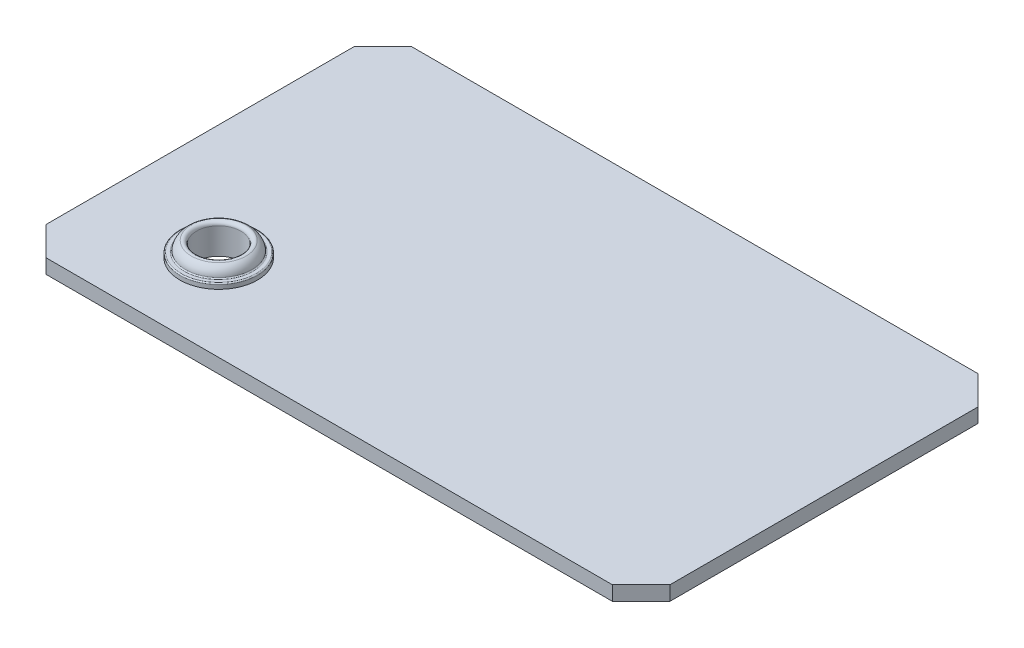
ISO-10303-21;
HEADER;
FILE_DESCRIPTION(('STEP AP214'),'2;1');
FILE_NAME('part.step','',(''),(''),'','','');
FILE_SCHEMA(('AUTOMOTIVE_DESIGN { 1 0 10303 214 1 1 1 1 }'));
ENDSEC;
DATA;
#1=APPLICATION_CONTEXT('core data for automotive mechanical design processes');
#2=APPLICATION_PROTOCOL_DEFINITION('international standard','automotive_design',2000,#1);
#3=PRODUCT_CONTEXT('',#1,'mechanical');
#4=PRODUCT('Part','Part','',(#3));
#5=PRODUCT_RELATED_PRODUCT_CATEGORY('part','',(#4));
#6=PRODUCT_DEFINITION_FORMATION('','',#4);
#7=PRODUCT_DEFINITION_CONTEXT('part definition',#1,'design');
#8=PRODUCT_DEFINITION('design','',#6,#7);
#9=PRODUCT_DEFINITION_SHAPE('','',#8);
#10=(LENGTH_UNIT() NAMED_UNIT(*) SI_UNIT(.MILLI.,.METRE.));
#11=(NAMED_UNIT(*) PLANE_ANGLE_UNIT() SI_UNIT($,.RADIAN.));
#12=(NAMED_UNIT(*) SI_UNIT($,.STERADIAN.) SOLID_ANGLE_UNIT());
#13=UNCERTAINTY_MEASURE_WITH_UNIT(LENGTH_MEASURE(1.E-05),#10,'distance_accuracy_value','');
#14=(GEOMETRIC_REPRESENTATION_CONTEXT(3) GLOBAL_UNCERTAINTY_ASSIGNED_CONTEXT((#13)) GLOBAL_UNIT_ASSIGNED_CONTEXT((#10,
#11,#12)) REPRESENTATION_CONTEXT('',''));
#15=CARTESIAN_POINT('',(0.,0.,0.));
#16=DIRECTION('',(0.,0.,1.));
#17=DIRECTION('',(1.,0.,0.));
#18=AXIS2_PLACEMENT_3D('',#15,#16,#17);
#19=CARTESIAN_POINT('',(6.35,-3.175,0.));
#20=DIRECTION('',(0.,0.,1.));
#21=DIRECTION('',(1.,0.,0.));
#22=AXIS2_PLACEMENT_3D('',#19,#20,#21);
#23=PLANE('',#22);
#24=DIRECTION('',(1.,0.,0.));
#25=VECTOR('',#24,1.);
#26=CARTESIAN_POINT('',(6.35,0.,0.));
#27=LINE('',#26,#25);
#28=CARTESIAN_POINT('',(6.35,0.,0.));
#29=VERTEX_POINT('',#28);
#30=CARTESIAN_POINT('',(131.293364515881,0.,0.));
#31=VERTEX_POINT('',#30);
#32=EDGE_CURVE('E129',#29,#31,#27,.T.);
#33=ORIENTED_EDGE('',*,*,#32,.F.);
#34=DIRECTION('',(0.,1.,0.));
#35=VECTOR('',#34,1.);
#36=CARTESIAN_POINT('',(6.35,-3.175,0.));
#37=LINE('',#36,#35);
#38=CARTESIAN_POINT('',(6.35,-3.175,0.));
#39=VERTEX_POINT('',#38);
#40=EDGE_CURVE('E39',#39,#29,#37,.T.);
#41=ORIENTED_EDGE('',*,*,#40,.F.);
#42=DIRECTION('',(1.,0.,0.));
#43=VECTOR('',#42,1.);
#44=CARTESIAN_POINT('',(6.35,-3.175,0.));
#45=LINE('',#44,#43);
#46=CARTESIAN_POINT('',(131.293364515881,-3.175,0.));
#47=VERTEX_POINT('',#46);
#48=EDGE_CURVE('E151',#39,#47,#45,.T.);
#49=ORIENTED_EDGE('',*,*,#48,.T.);
#50=DIRECTION('',(0.,1.,0.));
#51=VECTOR('',#50,1.);
#52=CARTESIAN_POINT('',(131.293364515881,-3.175,0.));
#53=LINE('',#52,#51);
#54=EDGE_CURVE('E87',#47,#31,#53,.T.);
#55=ORIENTED_EDGE('',*,*,#54,.T.);
#56=EDGE_LOOP('',(#33,#41,#49,#55));
#57=FACE_BOUND('',#56,.T.);
#58=ADVANCED_FACE('F31',(#57),#23,.T.);
#59=CARTESIAN_POINT('',(6.35,-3.175,0.));
#60=DIRECTION('',(-0.707106781186548,0.,0.707106781186548));
#61=DIRECTION('',(0.707106781186548,0.,0.707106781186548));
#62=AXIS2_PLACEMENT_3D('',#59,#60,#61);
#63=PLANE('',#62);
#64=DIRECTION('',(0.707106781186547,0.,0.707106781186547));
#65=VECTOR('',#64,1.);
#66=CARTESIAN_POINT('',(6.35,0.,0.));
#67=LINE('',#66,#65);
#68=CARTESIAN_POINT('',(0.,0.,-6.35));
#69=VERTEX_POINT('',#68);
#70=EDGE_CURVE('E148',#69,#29,#67,.T.);
#71=ORIENTED_EDGE('',*,*,#70,.F.);
#72=DIRECTION('',(0.,1.,0.));
#73=VECTOR('',#72,1.);
#74=CARTESIAN_POINT('',(0.,-3.175,-6.35));
#75=LINE('',#74,#73);
#76=CARTESIAN_POINT('',(0.,-3.175,-6.35));
#77=VERTEX_POINT('',#76);
#78=EDGE_CURVE('E75',#77,#69,#75,.T.);
#79=ORIENTED_EDGE('',*,*,#78,.F.);
#80=DIRECTION('',(0.707106781186547,0.,0.707106781186547));
#81=VECTOR('',#80,1.);
#82=CARTESIAN_POINT('',(6.35,-3.175,0.));
#83=LINE('',#82,#81);
#84=EDGE_CURVE('E119',#77,#39,#83,.T.);
#85=ORIENTED_EDGE('',*,*,#84,.T.);
#86=ORIENTED_EDGE('',*,*,#40,.T.);
#87=EDGE_LOOP('',(#71,#79,#85,#86));
#88=FACE_BOUND('',#87,.T.);
#89=ADVANCED_FACE('F164',(#88),#63,.T.);
#90=CARTESIAN_POINT('',(0.,-3.175,-6.35));
#91=DIRECTION('',(-1.,0.,0.));
#92=DIRECTION('',(0.,0.,1.));
#93=AXIS2_PLACEMENT_3D('',#90,#91,#92);
#94=PLANE('',#93);
#95=DIRECTION('',(0.,0.,1.));
#96=VECTOR('',#95,1.);
#97=CARTESIAN_POINT('',(0.,0.,-6.35));
#98=LINE('',#97,#96);
#99=CARTESIAN_POINT('',(0.,0.,-74.3051252847381));
#100=VERTEX_POINT('',#99);
#101=EDGE_CURVE('E106',#100,#69,#98,.T.);
#102=ORIENTED_EDGE('',*,*,#101,.F.);
#103=DIRECTION('',(0.,1.,0.));
#104=VECTOR('',#103,1.);
#105=CARTESIAN_POINT('',(0.,-3.175,-74.3051252847381));
#106=LINE('',#105,#104);
#107=CARTESIAN_POINT('',(0.,-3.175,-74.3051252847381));
#108=VERTEX_POINT('',#107);
#109=EDGE_CURVE('E101',#108,#100,#106,.T.);
#110=ORIENTED_EDGE('',*,*,#109,.F.);
#111=DIRECTION('',(0.,0.,1.));
#112=VECTOR('',#111,1.);
#113=CARTESIAN_POINT('',(0.,-3.175,-6.35));
#114=LINE('',#113,#112);
#115=EDGE_CURVE('E104',#108,#77,#114,.T.);
#116=ORIENTED_EDGE('',*,*,#115,.T.);
#117=ORIENTED_EDGE('',*,*,#78,.T.);
#118=EDGE_LOOP('',(#102,#110,#116,#117));
#119=FACE_BOUND('',#118,.T.);
#120=ADVANCED_FACE('F103',(#119),#94,.T.);
#121=CARTESIAN_POINT('',(0.,-3.175,-74.3051252847381));
#122=DIRECTION('',(-0.707106781186547,0.,-0.707106781186548));
#123=DIRECTION('',(-0.707106781186548,0.,0.707106781186547));
#124=AXIS2_PLACEMENT_3D('',#121,#122,#123);
#125=PLANE('',#124);
#126=DIRECTION('',(-0.707106781186548,0.,0.707106781186547));
#127=VECTOR('',#126,1.);
#128=CARTESIAN_POINT('',(0.,0.,-74.3051252847381));
#129=LINE('',#128,#127);
#130=CARTESIAN_POINT('',(6.35,0.,-80.6551252847381));
#131=VERTEX_POINT('',#130);
#132=EDGE_CURVE('E145',#131,#100,#129,.T.);
#133=ORIENTED_EDGE('',*,*,#132,.F.);
#134=DIRECTION('',(0.,1.,0.));
#135=VECTOR('',#134,1.);
#136=CARTESIAN_POINT('',(6.35,-3.175,-80.6551252847381));
#137=LINE('',#136,#135);
#138=CARTESIAN_POINT('',(6.35,-3.175,-80.6551252847381));
#139=VERTEX_POINT('',#138);
#140=EDGE_CURVE('E111',#139,#131,#137,.T.);
#141=ORIENTED_EDGE('',*,*,#140,.F.);
#142=DIRECTION('',(-0.707106781186548,0.,0.707106781186547));
#143=VECTOR('',#142,1.);
#144=CARTESIAN_POINT('',(0.,-3.175,-74.3051252847381));
#145=LINE('',#144,#143);
#146=EDGE_CURVE('E117',#139,#108,#145,.T.);
#147=ORIENTED_EDGE('',*,*,#146,.T.);
#148=ORIENTED_EDGE('',*,*,#109,.T.);
#149=EDGE_LOOP('',(#133,#141,#147,#148));
#150=FACE_BOUND('',#149,.T.);
#151=ADVANCED_FACE('F121',(#150),#125,.T.);
#152=CARTESIAN_POINT('',(6.35,-3.175,-80.6551252847381));
#153=DIRECTION('',(0.,0.,-1.));
#154=DIRECTION('',(-1.,0.,0.));
#155=AXIS2_PLACEMENT_3D('',#152,#153,#154);
#156=PLANE('',#155);
#157=DIRECTION('',(-1.,0.,0.));
#158=VECTOR('',#157,1.);
#159=CARTESIAN_POINT('',(6.35,0.,-80.6551252847381));
#160=LINE('',#159,#158);
#161=CARTESIAN_POINT('',(131.293364515881,0.,-80.6551252847381));
#162=VERTEX_POINT('',#161);
#163=EDGE_CURVE('E142',#162,#131,#160,.T.);
#164=ORIENTED_EDGE('',*,*,#163,.F.);
#165=DIRECTION('',(0.,1.,0.));
#166=VECTOR('',#165,1.);
#167=CARTESIAN_POINT('',(131.293364515881,-3.175,-80.6551252847381));
#168=LINE('',#167,#166);
#169=CARTESIAN_POINT('',(131.293364515881,-3.175,-80.6551252847381));
#170=VERTEX_POINT('',#169);
#171=EDGE_CURVE('E155',#170,#162,#168,.T.);
#172=ORIENTED_EDGE('',*,*,#171,.F.);
#173=DIRECTION('',(-1.,0.,0.));
#174=VECTOR('',#173,1.);
#175=CARTESIAN_POINT('',(6.35,-3.175,-80.6551252847381));
#176=LINE('',#175,#174);
#177=EDGE_CURVE('E122',#170,#139,#176,.T.);
#178=ORIENTED_EDGE('',*,*,#177,.T.);
#179=ORIENTED_EDGE('',*,*,#140,.T.);
#180=EDGE_LOOP('',(#164,#172,#178,#179));
#181=FACE_BOUND('',#180,.T.);
#182=ADVANCED_FACE('F177',(#181),#156,.T.);
#183=CARTESIAN_POINT('',(137.643364515881,-3.175,-74.3051252847381));
#184=DIRECTION('',(0.707106781186548,0.,-0.707106781186548));
#185=DIRECTION('',(-0.707106781186548,0.,-0.707106781186548));
#186=AXIS2_PLACEMENT_3D('',#183,#184,#185);
#187=PLANE('',#186);
#188=DIRECTION('',(-0.707106781186547,0.,-0.707106781186547));
#189=VECTOR('',#188,1.);
#190=CARTESIAN_POINT('',(137.643364515881,0.,-74.3051252847381));
#191=LINE('',#190,#189);
#192=CARTESIAN_POINT('',(137.643364515881,0.,-74.3051252847381));
#193=VERTEX_POINT('',#192);
#194=EDGE_CURVE('E139',#193,#162,#191,.T.);
#195=ORIENTED_EDGE('',*,*,#194,.F.);
#196=DIRECTION('',(0.,1.,0.));
#197=VECTOR('',#196,1.);
#198=CARTESIAN_POINT('',(137.643364515881,-3.175,-74.3051252847381));
#199=LINE('',#198,#197);
#200=CARTESIAN_POINT('',(137.643364515881,-3.175,-74.3051252847381));
#201=VERTEX_POINT('',#200);
#202=EDGE_CURVE('E157',#201,#193,#199,.T.);
#203=ORIENTED_EDGE('',*,*,#202,.F.);
#204=DIRECTION('',(-0.707106781186547,0.,-0.707106781186547));
#205=VECTOR('',#204,1.);
#206=CARTESIAN_POINT('',(137.643364515881,-3.175,-74.3051252847381));
#207=LINE('',#206,#205);
#208=EDGE_CURVE('E124',#201,#170,#207,.T.);
#209=ORIENTED_EDGE('',*,*,#208,.T.);
#210=ORIENTED_EDGE('',*,*,#171,.T.);
#211=EDGE_LOOP('',(#195,#203,#209,#210));
#212=FACE_BOUND('',#211,.T.);
#213=ADVANCED_FACE('F180',(#212),#187,.T.);
#214=CARTESIAN_POINT('',(137.643364515881,-3.175,-6.35));
#215=DIRECTION('',(1.,0.,0.));
#216=DIRECTION('',(0.,0.,-1.));
#217=AXIS2_PLACEMENT_3D('',#214,#215,#216);
#218=PLANE('',#217);
#219=DIRECTION('',(0.,0.,-1.));
#220=VECTOR('',#219,1.);
#221=CARTESIAN_POINT('',(137.643364515881,0.,-6.35));
#222=LINE('',#221,#220);
#223=CARTESIAN_POINT('',(137.643364515881,0.,-6.35));
#224=VERTEX_POINT('',#223);
#225=EDGE_CURVE('E136',#224,#193,#222,.T.);
#226=ORIENTED_EDGE('',*,*,#225,.F.);
#227=DIRECTION('',(0.,1.,0.));
#228=VECTOR('',#227,1.);
#229=CARTESIAN_POINT('',(137.643364515881,-3.175,-6.35));
#230=LINE('',#229,#228);
#231=CARTESIAN_POINT('',(137.643364515881,-3.175,-6.35));
#232=VERTEX_POINT('',#231);
#233=EDGE_CURVE('E159',#232,#224,#230,.T.);
#234=ORIENTED_EDGE('',*,*,#233,.F.);
#235=DIRECTION('',(0.,0.,-1.));
#236=VECTOR('',#235,1.);
#237=CARTESIAN_POINT('',(137.643364515881,-3.175,-6.35));
#238=LINE('',#237,#236);
#239=EDGE_CURVE('E254',#232,#201,#238,.T.);
#240=ORIENTED_EDGE('',*,*,#239,.T.);
#241=ORIENTED_EDGE('',*,*,#202,.T.);
#242=EDGE_LOOP('',(#226,#234,#240,#241));
#243=FACE_BOUND('',#242,.T.);
#244=ADVANCED_FACE('F184',(#243),#218,.T.);
#245=CARTESIAN_POINT('',(131.293364515881,-3.175,0.));
#246=DIRECTION('',(0.707106781186548,0.,0.707106781186547));
#247=DIRECTION('',(0.707106781186547,0.,-0.707106781186548));
#248=AXIS2_PLACEMENT_3D('',#245,#246,#247);
#249=PLANE('',#248);
#250=DIRECTION('',(0.707106781186547,0.,-0.707106781186548));
#251=VECTOR('',#250,1.);
#252=CARTESIAN_POINT('',(131.293364515881,0.,0.));
#253=LINE('',#252,#251);
#254=EDGE_CURVE('E132',#31,#224,#253,.T.);
#255=ORIENTED_EDGE('',*,*,#254,.F.);
#256=ORIENTED_EDGE('',*,*,#54,.F.);
#257=DIRECTION('',(0.707106781186547,0.,-0.707106781186548));
#258=VECTOR('',#257,1.);
#259=CARTESIAN_POINT('',(131.293364515881,-3.175,0.));
#260=LINE('',#259,#258);
#261=EDGE_CURVE('E252',#47,#232,#260,.T.);
#262=ORIENTED_EDGE('',*,*,#261,.T.);
#263=ORIENTED_EDGE('',*,*,#233,.T.);
#264=EDGE_LOOP('',(#255,#256,#262,#263));
#265=FACE_BOUND('',#264,.T.);
#266=ADVANCED_FACE('F160',(#265),#249,.T.);
#267=CARTESIAN_POINT('',(137.643364515881,-3.175,0.));
#268=DIRECTION('',(0.,1.,0.));
#269=DIRECTION('',(0.,0.,1.));
#270=AXIS2_PLACEMENT_3D('',#267,#268,#269);
#271=PLANE('',#270);
#272=CARTESIAN_POINT('',(25.4,-3.175,-19.05));
#273=DIRECTION('',(0.,1.,0.));
#274=DIRECTION('',(0.,0.,1.));
#275=AXIS2_PLACEMENT_3D('',#272,#273,#274);
#276=CIRCLE('',#275,4.89952377095647);
#277=CARTESIAN_POINT('',(25.4,-3.175,-14.1504762290435));
#278=VERTEX_POINT('',#277);
#279=EDGE_CURVE('E233',#278,#278,#276,.T.);
#280=ORIENTED_EDGE('',*,*,#279,.T.);
#281=EDGE_LOOP('',(#280));
#282=FACE_BOUND('',#281,.T.);
#283=ORIENTED_EDGE('',*,*,#48,.F.);
#284=ORIENTED_EDGE('',*,*,#84,.F.);
#285=ORIENTED_EDGE('',*,*,#115,.F.);
#286=ORIENTED_EDGE('',*,*,#146,.F.);
#287=ORIENTED_EDGE('',*,*,#177,.F.);
#288=ORIENTED_EDGE('',*,*,#208,.F.);
#289=ORIENTED_EDGE('',*,*,#239,.F.);
#290=ORIENTED_EDGE('',*,*,#261,.F.);
#291=EDGE_LOOP('',(#283,#284,#285,#286,#287,#288,#289,#290));
#292=FACE_BOUND('',#291,.T.);
#293=ADVANCED_FACE('F115',(#282,#292),#271,.F.);
#294=CARTESIAN_POINT('',(137.643364515881,0.,0.));
#295=DIRECTION('',(0.,1.,0.));
#296=DIRECTION('',(0.,0.,1.));
#297=AXIS2_PLACEMENT_3D('',#294,#295,#296);
#298=PLANE('',#297);
#299=CARTESIAN_POINT('',(25.4,0.,-19.05));
#300=DIRECTION('',(0.,1.,0.));
#301=DIRECTION('',(0.,0.,1.));
#302=AXIS2_PLACEMENT_3D('',#299,#300,#301);
#303=CIRCLE('',#302,8.55246050714919);
#304=CARTESIAN_POINT('',(25.4,0.,-10.4975394928508));
#305=VERTEX_POINT('',#304);
#306=EDGE_CURVE('E11',#305,#305,#303,.T.);
#307=ORIENTED_EDGE('',*,*,#306,.F.);
#308=EDGE_LOOP('',(#307));
#309=FACE_BOUND('',#308,.T.);
#310=ORIENTED_EDGE('',*,*,#32,.T.);
#311=ORIENTED_EDGE('',*,*,#254,.T.);
#312=ORIENTED_EDGE('',*,*,#225,.T.);
#313=ORIENTED_EDGE('',*,*,#194,.T.);
#314=ORIENTED_EDGE('',*,*,#163,.T.);
#315=ORIENTED_EDGE('',*,*,#132,.T.);
#316=ORIENTED_EDGE('',*,*,#101,.T.);
#317=ORIENTED_EDGE('',*,*,#70,.T.);
#318=EDGE_LOOP('',(#310,#311,#312,#313,#314,#315,#316,#317));
#319=FACE_BOUND('',#318,.T.);
#320=ADVANCED_FACE('F163',(#309,#319),#298,.T.);
#321=CARTESIAN_POINT('',(25.4,0.,-19.05));
#322=DIRECTION('',(0.,-1.,0.));
#323=DIRECTION('',(0.,0.,-1.));
#324=AXIS2_PLACEMENT_3D('',#321,#322,#323);
#325=CYLINDRICAL_SURFACE('',#324,8.55246050714919);
#326=CARTESIAN_POINT('',(25.4,0.90459086035577,-19.05));
#327=DIRECTION('',(0.,-1.,0.));
#328=DIRECTION('',(0.,0.,-1.));
#329=AXIS2_PLACEMENT_3D('',#326,#327,#328);
#330=CIRCLE('',#329,8.55246050714919);
#331=CARTESIAN_POINT('',(25.4,0.90459086035577,-27.6024605071492));
#332=VERTEX_POINT('',#331);
#333=EDGE_CURVE('E133',#332,#332,#330,.T.);
#334=ORIENTED_EDGE('',*,*,#333,.T.);
#335=EDGE_LOOP('',(#334));
#336=FACE_BOUND('',#335,.T.);
#337=ORIENTED_EDGE('',*,*,#306,.T.);
#338=EDGE_LOOP('',(#337));
#339=FACE_BOUND('',#338,.T.);
#340=ADVANCED_FACE('F196',(#336,#339),#325,.T.);
#341=CARTESIAN_POINT('',(25.4,0.904590860355771,-19.05));
#342=DIRECTION('',(0.,-1.,0.));
#343=DIRECTION('',(0.,0.,-1.));
#344=AXIS2_PLACEMENT_3D('',#341,#342,#343);
#345=TOROIDAL_SURFACE('',#344,8.29846050714919,0.253999999999999);
#346=CARTESIAN_POINT('',(25.4,1.15859086035577,-19.05));
#347=DIRECTION('',(0.,-1.,0.));
#348=DIRECTION('',(0.,0.,-1.));
#349=AXIS2_PLACEMENT_3D('',#346,#347,#348);
#350=CIRCLE('',#349,8.29846050714918);
#351=CARTESIAN_POINT('',(25.4,1.15859086035577,-27.3484605071492));
#352=VERTEX_POINT('',#351);
#353=EDGE_CURVE('E246',#352,#352,#350,.T.);
#354=ORIENTED_EDGE('',*,*,#353,.T.);
#355=EDGE_LOOP('',(#354));
#356=FACE_BOUND('',#355,.T.);
#357=ORIENTED_EDGE('',*,*,#333,.F.);
#358=EDGE_LOOP('',(#357));
#359=FACE_BOUND('',#358,.T.);
#360=ADVANCED_FACE('F202',(#356,#359),#345,.T.);
#361=CARTESIAN_POINT('',(33.6984605071492,1.15859086035577,-19.05));
#362=DIRECTION('',(0.,1.,0.));
#363=DIRECTION('',(0.,0.,1.));
#364=AXIS2_PLACEMENT_3D('',#361,#362,#363);
#365=PLANE('',#364);
#366=CARTESIAN_POINT('',(25.4,1.15859086035577,-19.05));
#367=DIRECTION('',(0.,-1.,0.));
#368=DIRECTION('',(0.,0.,-1.));
#369=AXIS2_PLACEMENT_3D('',#366,#367,#368);
#370=CIRCLE('',#369,7.56297166258563);
#371=CARTESIAN_POINT('',(25.4,1.15859086035577,-26.6129716625856));
#372=VERTEX_POINT('',#371);
#373=EDGE_CURVE('E243',#372,#372,#370,.T.);
#374=ORIENTED_EDGE('',*,*,#373,.T.);
#375=EDGE_LOOP('',(#374));
#376=FACE_BOUND('',#375,.T.);
#377=ORIENTED_EDGE('',*,*,#353,.F.);
#378=EDGE_LOOP('',(#377));
#379=FACE_BOUND('',#378,.T.);
#380=ADVANCED_FACE('F206',(#376,#379),#365,.T.);
#381=CARTESIAN_POINT('',(25.4,1.41259086035577,-19.05));
#382=DIRECTION('',(0.,-1.,0.));
#383=DIRECTION('',(0.,0.,-1.));
#384=AXIS2_PLACEMENT_3D('',#381,#382,#383);
#385=TOROIDAL_SURFACE('',#384,7.56297166258563,0.253999999999999);
#386=CARTESIAN_POINT('',(25.4,1.38847752377176,-19.05));
#387=DIRECTION('',(0.,-1.,0.));
#388=DIRECTION('',(0.,0.,-1.));
#389=AXIS2_PLACEMENT_3D('',#386,#387,#388);
#390=CIRCLE('',#389,7.31011884571624);
#391=CARTESIAN_POINT('',(25.4,1.38847752377176,-26.3601188457162));
#392=VERTEX_POINT('',#391);
#393=EDGE_CURVE('E240',#392,#392,#390,.T.);
#394=ORIENTED_EDGE('',*,*,#393,.T.);
#395=EDGE_LOOP('',(#394));
#396=FACE_BOUND('',#395,.T.);
#397=ORIENTED_EDGE('',*,*,#373,.F.);
#398=EDGE_LOOP('',(#397));
#399=FACE_BOUND('',#398,.T.);
#400=ADVANCED_FACE('F210',(#396,#399),#385,.F.);
#401=CARTESIAN_POINT('',(25.4,1.15859086035577,-19.05));
#402=DIRECTION('',(0.,-1.,0.));
#403=DIRECTION('',(0.,0.,-1.));
#404=AXIS2_PLACEMENT_3D('',#401,#402,#403);
#405=TOROIDAL_SURFACE('',#404,4.89952377095647,2.42153184832919);
#406=CARTESIAN_POINT('',(25.4,3.30976030562349,-19.05));
#407=DIRECTION('',(0.,-1.,0.));
#408=DIRECTION('',(0.,0.,-1.));
#409=AXIS2_PLACEMENT_3D('',#406,#407,#408);
#410=CIRCLE('',#409,6.01140798714949);
#411=CARTESIAN_POINT('',(25.4,3.30976030562349,-25.0614079871495));
#412=VERTEX_POINT('',#411);
#413=EDGE_CURVE('E235',#412,#412,#410,.T.);
#414=ORIENTED_EDGE('',*,*,#413,.T.);
#415=EDGE_LOOP('',(#414));
#416=FACE_BOUND('',#415,.T.);
#417=ORIENTED_EDGE('',*,*,#393,.F.);
#418=EDGE_LOOP('',(#417));
#419=FACE_BOUND('',#418,.T.);
#420=ADVANCED_FACE('F214',(#416,#419),#405,.T.);
#421=CARTESIAN_POINT('',(25.4,2.63283709339112,-19.05));
#422=DIRECTION('',(0.,-1.,0.));
#423=DIRECTION('',(0.,0.,-1.));
#424=AXIS2_PLACEMENT_3D('',#421,#422,#423);
#425=TOROIDAL_SURFACE('',#424,5.66152377095647,0.762);
#426=CARTESIAN_POINT('',(25.4,2.63283709339112,-19.05));
#427=DIRECTION('',(0.,-1.,0.));
#428=DIRECTION('',(0.,0.,-1.));
#429=AXIS2_PLACEMENT_3D('',#426,#427,#428);
#430=CIRCLE('',#429,4.89952377095647);
#431=CARTESIAN_POINT('',(25.4,2.63283709339112,-23.9495237709565));
#432=VERTEX_POINT('',#431);
#433=EDGE_CURVE('E231',#432,#432,#430,.T.);
#434=ORIENTED_EDGE('',*,*,#433,.T.);
#435=EDGE_LOOP('',(#434));
#436=FACE_BOUND('',#435,.T.);
#437=ORIENTED_EDGE('',*,*,#413,.F.);
#438=EDGE_LOOP('',(#437));
#439=FACE_BOUND('',#438,.T.);
#440=ADVANCED_FACE('F218',(#436,#439),#425,.T.);
#441=CARTESIAN_POINT('',(25.4,0.,-19.05));
#442=DIRECTION('',(0.,-1.,0.));
#443=DIRECTION('',(0.,0.,-1.));
#444=AXIS2_PLACEMENT_3D('',#441,#442,#443);
#445=CYLINDRICAL_SURFACE('',#444,4.89952377095647);
#446=ORIENTED_EDGE('',*,*,#433,.F.);
#447=EDGE_LOOP('',(#446));
#448=FACE_BOUND('',#447,.T.);
#449=ORIENTED_EDGE('',*,*,#279,.F.);
#450=EDGE_LOOP('',(#449));
#451=FACE_BOUND('',#450,.T.);
#452=ADVANCED_FACE('F222',(#448,#451),#445,.F.);
#453=CLOSED_SHELL('',(#58,#89,#120,#151,#182,#213,#244,#266,#293,#320,#340,#360,#380,#400,#420,
#440,#452));
#454=MANIFOLD_SOLID_BREP('B2',#453);
#455=ADVANCED_BREP_SHAPE_REPRESENTATION('',(#18,#454),#14);
#456=SHAPE_DEFINITION_REPRESENTATION(#9,#455);
ENDSEC;
END-ISO-10303-21;
